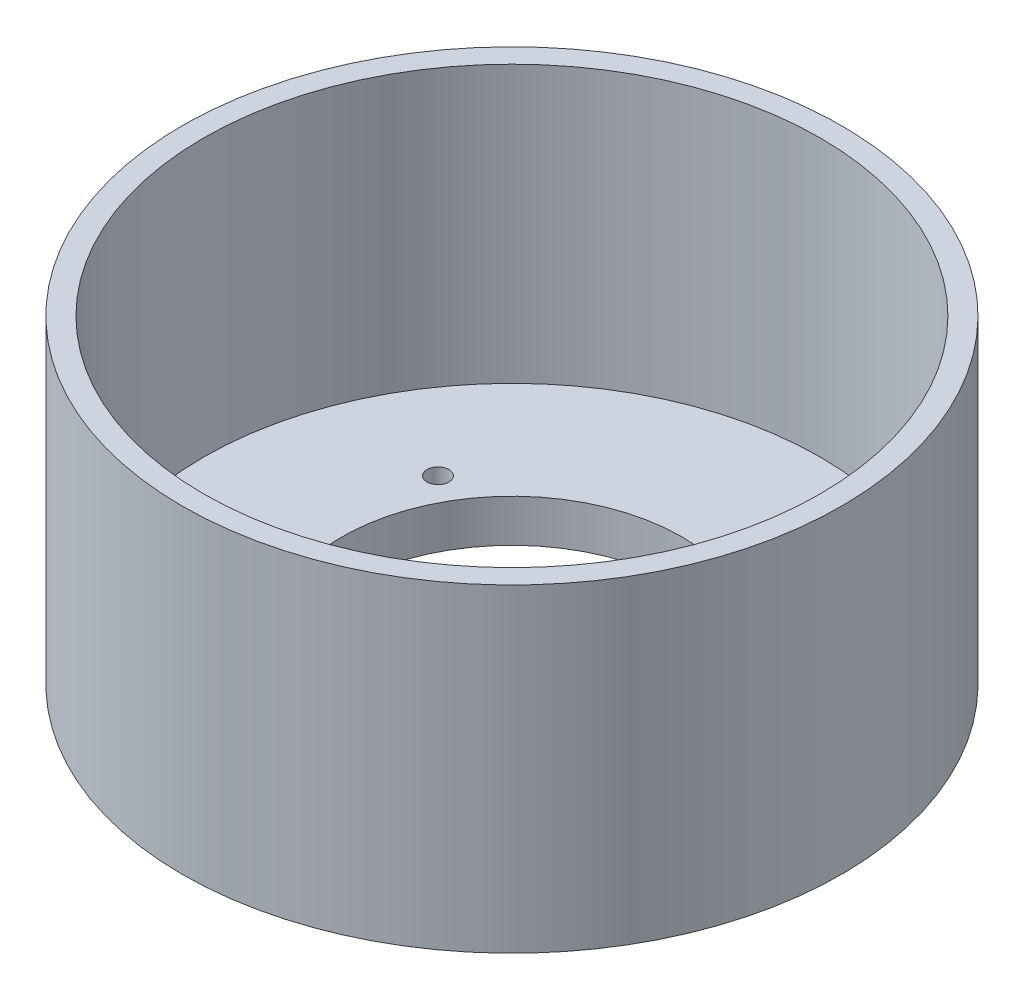
ISO-10303-21;
HEADER;
FILE_DESCRIPTION(('STEP AP214'),'2;1');
FILE_NAME('part.step','',(''),(''),'','','');
FILE_SCHEMA(('AUTOMOTIVE_DESIGN { 1 0 10303 214 1 1 1 1 }'));
ENDSEC;
DATA;
#1=APPLICATION_CONTEXT('core data for automotive mechanical design processes');
#2=APPLICATION_PROTOCOL_DEFINITION('international standard','automotive_design',2000,#1);
#3=PRODUCT_CONTEXT('',#1,'mechanical');
#4=PRODUCT('Part','Part','',(#3));
#5=PRODUCT_RELATED_PRODUCT_CATEGORY('part','',(#4));
#6=PRODUCT_DEFINITION_FORMATION('','',#4);
#7=PRODUCT_DEFINITION_CONTEXT('part definition',#1,'design');
#8=PRODUCT_DEFINITION('design','',#6,#7);
#9=PRODUCT_DEFINITION_SHAPE('','',#8);
#10=(LENGTH_UNIT() NAMED_UNIT(*) SI_UNIT(.MILLI.,.METRE.));
#11=(NAMED_UNIT(*) PLANE_ANGLE_UNIT() SI_UNIT($,.RADIAN.));
#12=(NAMED_UNIT(*) SI_UNIT($,.STERADIAN.) SOLID_ANGLE_UNIT());
#13=UNCERTAINTY_MEASURE_WITH_UNIT(LENGTH_MEASURE(1.E-05),#10,'distance_accuracy_value','');
#14=(GEOMETRIC_REPRESENTATION_CONTEXT(3) GLOBAL_UNCERTAINTY_ASSIGNED_CONTEXT((#13)) GLOBAL_UNIT_ASSIGNED_CONTEXT((#10,
#11,#12)) REPRESENTATION_CONTEXT('',''));
#15=CARTESIAN_POINT('',(0.,0.,0.));
#16=DIRECTION('',(0.,0.,1.));
#17=DIRECTION('',(1.,0.,0.));
#18=AXIS2_PLACEMENT_3D('',#15,#16,#17);
#19=CARTESIAN_POINT('',(0.,0.,0.));
#20=DIRECTION('',(0.,1.,0.));
#21=DIRECTION('',(0.,0.,1.));
#22=AXIS2_PLACEMENT_3D('',#19,#20,#21);
#23=CYLINDRICAL_SURFACE('',#22,16.);
#24=CARTESIAN_POINT('',(0.,0.,0.));
#25=DIRECTION('',(0.,-1.,0.));
#26=DIRECTION('',(0.,0.,-1.));
#27=AXIS2_PLACEMENT_3D('',#24,#25,#26);
#28=CIRCLE('',#27,16.);
#29=CARTESIAN_POINT('',(0.,0.,-16.));
#30=VERTEX_POINT('',#29);
#31=EDGE_CURVE('E58',#30,#30,#28,.T.);
#32=ORIENTED_EDGE('',*,*,#31,.T.);
#33=EDGE_LOOP('',(#32));
#34=FACE_BOUND('',#33,.T.);
#35=CARTESIAN_POINT('',(0.,4.,0.));
#36=DIRECTION('',(0.,1.,0.));
#37=DIRECTION('',(0.,0.,1.));
#38=AXIS2_PLACEMENT_3D('',#35,#36,#37);
#39=CIRCLE('',#38,16.);
#40=CARTESIAN_POINT('',(0.,4.,16.));
#41=VERTEX_POINT('',#40);
#42=EDGE_CURVE('E47',#41,#41,#39,.T.);
#43=ORIENTED_EDGE('',*,*,#42,.T.);
#44=EDGE_LOOP('',(#43));
#45=FACE_BOUND('',#44,.T.);
#46=ADVANCED_FACE('F43',(#34,#45),#23,.F.);
#47=CARTESIAN_POINT('',(0.,30.,0.));
#48=DIRECTION('',(0.,-1.,0.));
#49=DIRECTION('',(0.,0.,-1.));
#50=AXIS2_PLACEMENT_3D('',#47,#48,#49);
#51=CYLINDRICAL_SURFACE('',#50,31.);
#52=CARTESIAN_POINT('',(0.,30.,0.));
#53=DIRECTION('',(0.,1.,0.));
#54=DIRECTION('',(0.,0.,1.));
#55=AXIS2_PLACEMENT_3D('',#52,#53,#54);
#56=CIRCLE('',#55,31.);
#57=CARTESIAN_POINT('',(0.,30.,31.));
#58=VERTEX_POINT('',#57);
#59=EDGE_CURVE('E10',#58,#58,#56,.T.);
#60=ORIENTED_EDGE('',*,*,#59,.F.);
#61=EDGE_LOOP('',(#60));
#62=FACE_BOUND('',#61,.T.);
#63=CARTESIAN_POINT('',(0.,0.,0.));
#64=DIRECTION('',(0.,1.,0.));
#65=DIRECTION('',(0.,0.,1.));
#66=AXIS2_PLACEMENT_3D('',#63,#64,#65);
#67=CIRCLE('',#66,31.);
#68=CARTESIAN_POINT('',(0.,0.,31.));
#69=VERTEX_POINT('',#68);
#70=EDGE_CURVE('E52',#69,#69,#67,.T.);
#71=ORIENTED_EDGE('',*,*,#70,.T.);
#72=EDGE_LOOP('',(#71));
#73=FACE_BOUND('',#72,.T.);
#74=ADVANCED_FACE('F45',(#62,#73),#51,.T.);
#75=CARTESIAN_POINT('',(0.,30.,0.));
#76=DIRECTION('',(0.,1.,0.));
#77=DIRECTION('',(0.,0.,1.));
#78=AXIS2_PLACEMENT_3D('',#75,#76,#77);
#79=PLANE('',#78);
#80=CARTESIAN_POINT('',(0.,30.,0.));
#81=DIRECTION('',(0.,1.,0.));
#82=DIRECTION('',(0.,0.,1.));
#83=AXIS2_PLACEMENT_3D('',#80,#81,#82);
#84=CIRCLE('',#83,29.);
#85=CARTESIAN_POINT('',(0.,30.,29.));
#86=VERTEX_POINT('',#85);
#87=EDGE_CURVE('E63',#86,#86,#84,.T.);
#88=ORIENTED_EDGE('',*,*,#87,.F.);
#89=EDGE_LOOP('',(#88));
#90=FACE_BOUND('',#89,.T.);
#91=ORIENTED_EDGE('',*,*,#59,.T.);
#92=EDGE_LOOP('',(#91));
#93=FACE_BOUND('',#92,.T.);
#94=ADVANCED_FACE('F129',(#90,#93),#79,.T.);
#95=CARTESIAN_POINT('',(0.,0.,0.));
#96=DIRECTION('',(0.,1.,0.));
#97=DIRECTION('',(0.,0.,1.));
#98=AXIS2_PLACEMENT_3D('',#95,#96,#97);
#99=PLANE('',#98);
#100=CARTESIAN_POINT('',(-16.455,0.,-9.5));
#101=DIRECTION('',(0.,1.,0.));
#102=DIRECTION('',(0.,0.,1.));
#103=AXIS2_PLACEMENT_3D('',#100,#101,#102);
#104=CIRCLE('',#103,1.025);
#105=CARTESIAN_POINT('',(-16.455,0.,-8.475));
#106=VERTEX_POINT('',#105);
#107=EDGE_CURVE('E95',#106,#106,#104,.T.);
#108=ORIENTED_EDGE('',*,*,#107,.T.);
#109=EDGE_LOOP('',(#108));
#110=FACE_BOUND('',#109,.T.);
#111=CARTESIAN_POINT('',(16.455,0.,-9.5));
#112=DIRECTION('',(0.,1.,0.));
#113=DIRECTION('',(0.,0.,1.));
#114=AXIS2_PLACEMENT_3D('',#111,#112,#113);
#115=CIRCLE('',#114,1.025);
#116=CARTESIAN_POINT('',(16.455,0.,-8.475));
#117=VERTEX_POINT('',#116);
#118=EDGE_CURVE('E87',#117,#117,#115,.T.);
#119=ORIENTED_EDGE('',*,*,#118,.T.);
#120=EDGE_LOOP('',(#119));
#121=FACE_BOUND('',#120,.T.);
#122=CARTESIAN_POINT('',(16.455,0.,9.5));
#123=DIRECTION('',(0.,1.,0.));
#124=DIRECTION('',(0.,0.,1.));
#125=AXIS2_PLACEMENT_3D('',#122,#123,#124);
#126=CIRCLE('',#125,1.025);
#127=CARTESIAN_POINT('',(16.455,0.,10.525));
#128=VERTEX_POINT('',#127);
#129=EDGE_CURVE('E79',#128,#128,#126,.T.);
#130=ORIENTED_EDGE('',*,*,#129,.T.);
#131=EDGE_LOOP('',(#130));
#132=FACE_BOUND('',#131,.T.);
#133=CARTESIAN_POINT('',(-16.455,0.,9.5));
#134=DIRECTION('',(0.,1.,0.));
#135=DIRECTION('',(0.,0.,1.));
#136=AXIS2_PLACEMENT_3D('',#133,#134,#135);
#137=CIRCLE('',#136,1.025);
#138=CARTESIAN_POINT('',(-16.455,0.,10.525));
#139=VERTEX_POINT('',#138);
#140=EDGE_CURVE('E68',#139,#139,#137,.T.);
#141=ORIENTED_EDGE('',*,*,#140,.T.);
#142=EDGE_LOOP('',(#141));
#143=FACE_BOUND('',#142,.T.);
#144=ORIENTED_EDGE('',*,*,#31,.F.);
#145=EDGE_LOOP('',(#144));
#146=FACE_BOUND('',#145,.T.);
#147=ORIENTED_EDGE('',*,*,#70,.F.);
#148=EDGE_LOOP('',(#147));
#149=FACE_BOUND('',#148,.T.);
#150=ADVANCED_FACE('F125',(#110,#121,#132,#143,#146,#149),#99,.F.);
#151=CARTESIAN_POINT('',(0.,4.,0.));
#152=DIRECTION('',(0.,1.,0.));
#153=DIRECTION('',(0.,0.,1.));
#154=AXIS2_PLACEMENT_3D('',#151,#152,#153);
#155=CYLINDRICAL_SURFACE('',#154,29.);
#156=CARTESIAN_POINT('',(0.,4.,0.));
#157=DIRECTION('',(0.,1.,0.));
#158=DIRECTION('',(0.,0.,1.));
#159=AXIS2_PLACEMENT_3D('',#156,#157,#158);
#160=CIRCLE('',#159,29.);
#161=CARTESIAN_POINT('',(0.,4.,29.));
#162=VERTEX_POINT('',#161);
#163=EDGE_CURVE('E67',#162,#162,#160,.T.);
#164=CARTESIAN_POINT('',(0.,4.,29.));
#165=CARTESIAN_POINT('',(0.,4.27083333333333,29.));
#166=CARTESIAN_POINT('',(0.,4.54166666666667,29.));
#167=CARTESIAN_POINT('',(0.,5.08333333333333,29.));
#168=CARTESIAN_POINT('',(0.,5.35416666666667,29.));
#169=CARTESIAN_POINT('',(0.,5.89583333333333,29.));
#170=CARTESIAN_POINT('',(0.,6.16666666666667,29.));
#171=CARTESIAN_POINT('',(0.,6.70833333333333,29.));
#172=CARTESIAN_POINT('',(0.,6.97916666666667,29.));
#173=CARTESIAN_POINT('',(0.,7.52083333333333,29.));
#174=CARTESIAN_POINT('',(0.,7.79166666666667,29.));
#175=CARTESIAN_POINT('',(0.,8.33333333333333,29.));
#176=CARTESIAN_POINT('',(0.,8.60416666666667,29.));
#177=CARTESIAN_POINT('',(0.,9.14583333333333,29.));
#178=CARTESIAN_POINT('',(0.,9.41666666666667,29.));
#179=CARTESIAN_POINT('',(0.,9.95833333333333,29.));
#180=CARTESIAN_POINT('',(0.,10.2291666666667,29.));
#181=CARTESIAN_POINT('',(0.,10.7708333333333,29.));
#182=CARTESIAN_POINT('',(0.,11.0416666666667,29.));
#183=CARTESIAN_POINT('',(0.,11.5833333333333,29.));
#184=CARTESIAN_POINT('',(0.,11.8541666666667,29.));
#185=CARTESIAN_POINT('',(0.,12.3958333333333,29.));
#186=CARTESIAN_POINT('',(0.,12.6666666666667,29.));
#187=CARTESIAN_POINT('',(0.,13.2083333333333,29.));
#188=CARTESIAN_POINT('',(0.,13.4791666666667,29.));
#189=CARTESIAN_POINT('',(0.,14.0208333333333,29.));
#190=CARTESIAN_POINT('',(0.,14.2916666666667,29.));
#191=CARTESIAN_POINT('',(0.,14.8333333333333,29.));
#192=CARTESIAN_POINT('',(0.,15.1041666666667,29.));
#193=CARTESIAN_POINT('',(0.,15.6458333333333,29.));
#194=CARTESIAN_POINT('',(0.,15.9166666666667,29.));
#195=CARTESIAN_POINT('',(0.,16.4583333333333,29.));
#196=CARTESIAN_POINT('',(0.,16.7291666666667,29.));
#197=CARTESIAN_POINT('',(0.,17.2708333333333,29.));
#198=CARTESIAN_POINT('',(0.,17.5416666666667,29.));
#199=CARTESIAN_POINT('',(0.,18.0833333333333,29.));
#200=CARTESIAN_POINT('',(0.,18.3541666666667,29.));
#201=CARTESIAN_POINT('',(0.,18.8958333333333,29.));
#202=CARTESIAN_POINT('',(0.,19.1666666666667,29.));
#203=CARTESIAN_POINT('',(0.,19.7083333333333,29.));
#204=CARTESIAN_POINT('',(0.,19.9791666666667,29.));
#205=CARTESIAN_POINT('',(0.,20.5208333333333,29.));
#206=CARTESIAN_POINT('',(0.,20.7916666666667,29.));
#207=CARTESIAN_POINT('',(0.,21.3333333333333,29.));
#208=CARTESIAN_POINT('',(0.,21.6041666666667,29.));
#209=CARTESIAN_POINT('',(0.,22.1458333333333,29.));
#210=CARTESIAN_POINT('',(0.,22.4166666666667,29.));
#211=CARTESIAN_POINT('',(0.,22.9583333333333,29.));
#212=CARTESIAN_POINT('',(0.,23.2291666666667,29.));
#213=CARTESIAN_POINT('',(0.,23.7708333333333,29.));
#214=CARTESIAN_POINT('',(0.,24.0416666666667,29.));
#215=CARTESIAN_POINT('',(0.,24.5833333333333,29.));
#216=CARTESIAN_POINT('',(0.,24.8541666666667,29.));
#217=CARTESIAN_POINT('',(0.,25.3958333333333,29.));
#218=CARTESIAN_POINT('',(0.,25.6666666666667,29.));
#219=CARTESIAN_POINT('',(0.,26.2083333333333,29.));
#220=CARTESIAN_POINT('',(0.,26.4791666666667,29.));
#221=CARTESIAN_POINT('',(0.,27.0208333333333,29.));
#222=CARTESIAN_POINT('',(0.,27.2916666666667,29.));
#223=CARTESIAN_POINT('',(0.,27.8333333333333,29.));
#224=CARTESIAN_POINT('',(0.,28.1041666666667,29.));
#225=CARTESIAN_POINT('',(0.,28.6458333333333,29.));
#226=CARTESIAN_POINT('',(0.,28.9166666666667,29.));
#227=CARTESIAN_POINT('',(0.,29.4583333333333,29.));
#228=CARTESIAN_POINT('',(0.,29.7291666666667,29.));
#229=CARTESIAN_POINT('',(0.,30.,29.));
#230=B_SPLINE_CURVE_WITH_KNOTS('',3,(#164,#165,#166,#167,#168,#169,#170,#171,#172,#173,#174,
#175,#176,#177,#178,#179,#180,#181,#182,#183,#184,#185,#186,#187,#188,#189,#190,#191,#192,#193,
#194,#195,#196,#197,#198,#199,#200,#201,#202,#203,#204,#205,#206,#207,#208,#209,#210,#211,#212,
#213,#214,#215,#216,#217,#218,#219,#220,#221,#222,#223,#224,#225,#226,#227,#228,#229),
.UNSPECIFIED.,.F.,.F.,(4,2,2,2,2,2,2,2,2,2,2,2,2,2,2,2,2,2,2,2,2,2,2,2,2,2,2,2,2,2,2,2,4),(0.,
0.812500000000001,1.625,2.4375,3.25,4.0625,4.875,5.6875,6.5,7.3125,8.125,8.9375,9.75,10.5625,
11.375,12.1875,13.,13.8125,14.625,15.4375,16.25,17.0625,17.875,18.6875,19.5,20.3125,21.125,
21.9375,22.75,23.5625,24.375,25.1875,26.),.UNSPECIFIED.);
#231=EDGE_CURVE('BSEAM110',#162,#86,#230,.T.);
#232=ORIENTED_EDGE('',*,*,#163,.F.);
#233=ORIENTED_EDGE('',*,*,#87,.T.);
#234=ORIENTED_EDGE('',*,*,#231,.T.);
#235=ORIENTED_EDGE('',*,*,#231,.F.);
#236=EDGE_LOOP('',(#232,#234,#233,#235));
#237=FACE_BOUND('',#236,.T.);
#238=ADVANCED_FACE('F110',(#237),#155,.F.);
#239=CARTESIAN_POINT('',(0.,4.,0.));
#240=DIRECTION('',(0.,1.,0.));
#241=DIRECTION('',(0.,0.,1.));
#242=AXIS2_PLACEMENT_3D('',#239,#240,#241);
#243=PLANE('',#242);
#244=CARTESIAN_POINT('',(-16.455,4.,-9.5));
#245=DIRECTION('',(0.,1.,0.));
#246=DIRECTION('',(0.,0.,1.));
#247=AXIS2_PLACEMENT_3D('',#244,#245,#246);
#248=CIRCLE('',#247,1.02499999999999);
#249=CARTESIAN_POINT('',(-16.455,4.,-8.47500000000001));
#250=VERTEX_POINT('',#249);
#251=EDGE_CURVE('E99',#250,#250,#248,.T.);
#252=ORIENTED_EDGE('',*,*,#251,.F.);
#253=EDGE_LOOP('',(#252));
#254=FACE_BOUND('',#253,.T.);
#255=CARTESIAN_POINT('',(16.455,4.,-9.5));
#256=DIRECTION('',(0.,1.,0.));
#257=DIRECTION('',(0.,0.,1.));
#258=AXIS2_PLACEMENT_3D('',#255,#256,#257);
#259=CIRCLE('',#258,1.02499999999999);
#260=CARTESIAN_POINT('',(16.455,4.,-8.47500000000001));
#261=VERTEX_POINT('',#260);
#262=EDGE_CURVE('E91',#261,#261,#259,.T.);
#263=ORIENTED_EDGE('',*,*,#262,.F.);
#264=EDGE_LOOP('',(#263));
#265=FACE_BOUND('',#264,.T.);
#266=CARTESIAN_POINT('',(16.455,4.,9.5));
#267=DIRECTION('',(0.,1.,0.));
#268=DIRECTION('',(0.,0.,1.));
#269=AXIS2_PLACEMENT_3D('',#266,#267,#268);
#270=CIRCLE('',#269,1.02499999999999);
#271=CARTESIAN_POINT('',(16.455,4.,10.525));
#272=VERTEX_POINT('',#271);
#273=EDGE_CURVE('E83',#272,#272,#270,.T.);
#274=ORIENTED_EDGE('',*,*,#273,.F.);
#275=EDGE_LOOP('',(#274));
#276=FACE_BOUND('',#275,.T.);
#277=CARTESIAN_POINT('',(-16.455,4.,9.5));
#278=DIRECTION('',(0.,1.,0.));
#279=DIRECTION('',(0.,0.,1.));
#280=AXIS2_PLACEMENT_3D('',#277,#278,#279);
#281=CIRCLE('',#280,1.02499999999999);
#282=CARTESIAN_POINT('',(-16.455,4.,10.525));
#283=VERTEX_POINT('',#282);
#284=EDGE_CURVE('E75',#283,#283,#281,.T.);
#285=ORIENTED_EDGE('',*,*,#284,.F.);
#286=EDGE_LOOP('',(#285));
#287=FACE_BOUND('',#286,.T.);
#288=ORIENTED_EDGE('',*,*,#42,.F.);
#289=EDGE_LOOP('',(#288));
#290=FACE_BOUND('',#289,.T.);
#291=ORIENTED_EDGE('',*,*,#163,.T.);
#292=EDGE_LOOP('',(#291));
#293=FACE_BOUND('',#292,.T.);
#294=ADVANCED_FACE('F106',(#254,#265,#276,#287,#290,#293),#243,.T.);
#295=CARTESIAN_POINT('',(-16.455,4.,9.5));
#296=DIRECTION('',(0.,1.,0.));
#297=DIRECTION('',(0.,0.,1.));
#298=AXIS2_PLACEMENT_3D('',#295,#296,#297);
#299=CYLINDRICAL_SURFACE('',#298,1.02499999999999);
#300=ORIENTED_EDGE('',*,*,#140,.F.);
#301=EDGE_LOOP('',(#300));
#302=FACE_BOUND('',#301,.T.);
#303=ORIENTED_EDGE('',*,*,#284,.T.);
#304=EDGE_LOOP('',(#303));
#305=FACE_BOUND('',#304,.T.);
#306=ADVANCED_FACE('F109',(#302,#305),#299,.F.);
#307=CARTESIAN_POINT('',(16.455,4.,9.5));
#308=DIRECTION('',(0.,1.,0.));
#309=DIRECTION('',(0.,0.,1.));
#310=AXIS2_PLACEMENT_3D('',#307,#308,#309);
#311=CYLINDRICAL_SURFACE('',#310,1.02499999999999);
#312=ORIENTED_EDGE('',*,*,#129,.F.);
#313=EDGE_LOOP('',(#312));
#314=FACE_BOUND('',#313,.T.);
#315=ORIENTED_EDGE('',*,*,#273,.T.);
#316=EDGE_LOOP('',(#315));
#317=FACE_BOUND('',#316,.T.);
#318=ADVANCED_FACE('F147',(#314,#317),#311,.F.);
#319=CARTESIAN_POINT('',(16.455,4.,-9.5));
#320=DIRECTION('',(0.,1.,0.));
#321=DIRECTION('',(0.,0.,1.));
#322=AXIS2_PLACEMENT_3D('',#319,#320,#321);
#323=CYLINDRICAL_SURFACE('',#322,1.02499999999999);
#324=ORIENTED_EDGE('',*,*,#118,.F.);
#325=EDGE_LOOP('',(#324));
#326=FACE_BOUND('',#325,.T.);
#327=ORIENTED_EDGE('',*,*,#262,.T.);
#328=EDGE_LOOP('',(#327));
#329=FACE_BOUND('',#328,.T.);
#330=ADVANCED_FACE('F151',(#326,#329),#323,.F.);
#331=CARTESIAN_POINT('',(-16.455,4.,-9.5));
#332=DIRECTION('',(0.,1.,0.));
#333=DIRECTION('',(0.,0.,1.));
#334=AXIS2_PLACEMENT_3D('',#331,#332,#333);
#335=CYLINDRICAL_SURFACE('',#334,1.02499999999999);
#336=ORIENTED_EDGE('',*,*,#107,.F.);
#337=EDGE_LOOP('',(#336));
#338=FACE_BOUND('',#337,.T.);
#339=ORIENTED_EDGE('',*,*,#251,.T.);
#340=EDGE_LOOP('',(#339));
#341=FACE_BOUND('',#340,.T.);
#342=ADVANCED_FACE('F104',(#338,#341),#335,.F.);
#343=CLOSED_SHELL('',(#46,#74,#94,#150,#238,#294,#306,#318,#330,#342));
#344=MANIFOLD_SOLID_BREP('B2',#343);
#345=ADVANCED_BREP_SHAPE_REPRESENTATION('',(#18,#344),#14);
#346=SHAPE_DEFINITION_REPRESENTATION(#9,#345);
ENDSEC;
END-ISO-10303-21;
